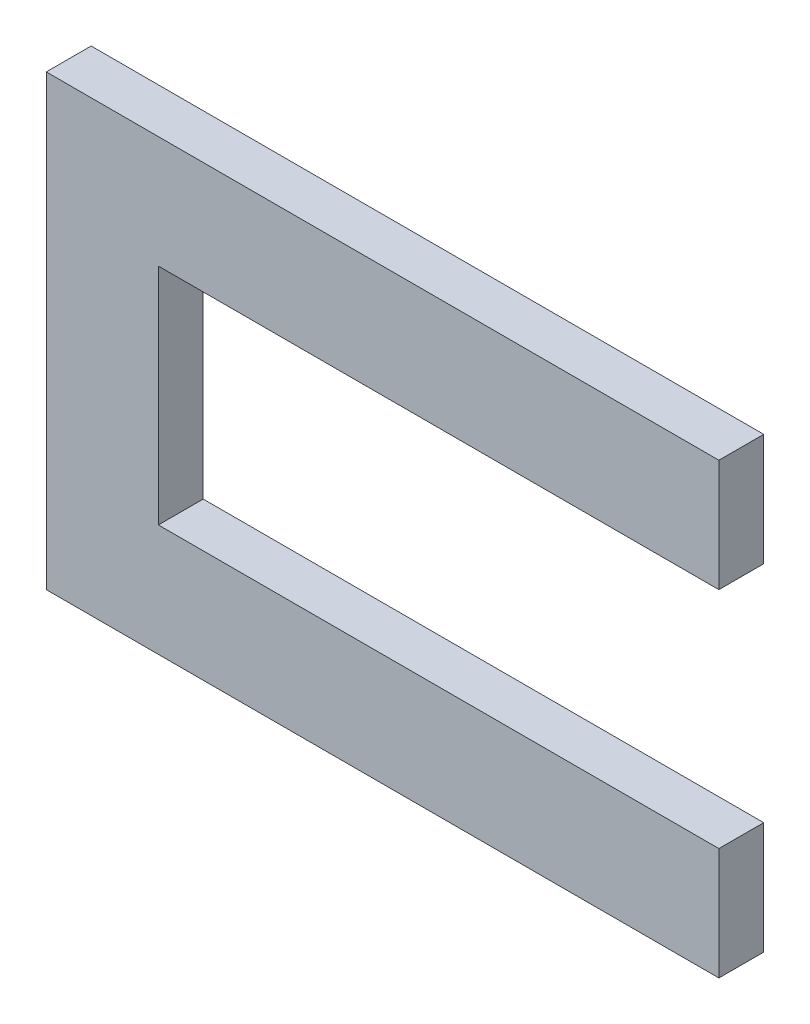
ISO-10303-21;
HEADER;
FILE_DESCRIPTION(('STEP AP214'),'2;1');
FILE_NAME('part.step','',(''),(''),'','','');
FILE_SCHEMA(('AUTOMOTIVE_DESIGN { 1 0 10303 214 1 1 1 1 }'));
ENDSEC;
DATA;
#1=APPLICATION_CONTEXT('core data for automotive mechanical design processes');
#2=APPLICATION_PROTOCOL_DEFINITION('international standard','automotive_design',2000,#1);
#3=PRODUCT_CONTEXT('',#1,'mechanical');
#4=PRODUCT('Part','Part','',(#3));
#5=PRODUCT_RELATED_PRODUCT_CATEGORY('part','',(#4));
#6=PRODUCT_DEFINITION_FORMATION('','',#4);
#7=PRODUCT_DEFINITION_CONTEXT('part definition',#1,'design');
#8=PRODUCT_DEFINITION('design','',#6,#7);
#9=PRODUCT_DEFINITION_SHAPE('','',#8);
#10=(LENGTH_UNIT() NAMED_UNIT(*) SI_UNIT(.MILLI.,.METRE.));
#11=(NAMED_UNIT(*) PLANE_ANGLE_UNIT() SI_UNIT($,.RADIAN.));
#12=(NAMED_UNIT(*) SI_UNIT($,.STERADIAN.) SOLID_ANGLE_UNIT());
#13=UNCERTAINTY_MEASURE_WITH_UNIT(LENGTH_MEASURE(1.E-05),#10,'distance_accuracy_value','');
#14=(GEOMETRIC_REPRESENTATION_CONTEXT(3) GLOBAL_UNCERTAINTY_ASSIGNED_CONTEXT((#13)) GLOBAL_UNIT_ASSIGNED_CONTEXT((#10,
#11,#12)) REPRESENTATION_CONTEXT('',''));
#15=CARTESIAN_POINT('',(0.,0.,0.));
#16=DIRECTION('',(0.,0.,1.));
#17=DIRECTION('',(1.,0.,0.));
#18=AXIS2_PLACEMENT_3D('',#15,#16,#17);
#19=CARTESIAN_POINT('',(0.,-5.,2.));
#20=DIRECTION('',(0.,-1.,0.));
#21=DIRECTION('',(1.,0.,0.));
#22=AXIS2_PLACEMENT_3D('',#19,#20,#21);
#23=PLANE('',#22);
#24=DIRECTION('',(-1.,0.,0.));
#25=VECTOR('',#24,1.);
#26=CARTESIAN_POINT('',(0.,-5.,0.));
#27=LINE('',#26,#25);
#28=CARTESIAN_POINT('',(15.,-5.,0.));
#29=VERTEX_POINT('',#28);
#30=CARTESIAN_POINT('',(-10.,-5.00000000000001,0.));
#31=VERTEX_POINT('',#30);
#32=EDGE_CURVE('E130',#29,#31,#27,.T.);
#33=ORIENTED_EDGE('',*,*,#32,.T.);
#34=DIRECTION('',(0.,0.,-1.));
#35=VECTOR('',#34,1.);
#36=CARTESIAN_POINT('',(-10.,-5.00000000000001,2.));
#37=LINE('',#36,#35);
#38=CARTESIAN_POINT('',(-10.,-5.00000000000001,2.));
#39=VERTEX_POINT('',#38);
#40=EDGE_CURVE('E11',#39,#31,#37,.T.);
#41=ORIENTED_EDGE('',*,*,#40,.F.);
#42=DIRECTION('',(-1.,0.,0.));
#43=VECTOR('',#42,1.);
#44=CARTESIAN_POINT('',(0.,-5.,2.));
#45=LINE('',#44,#43);
#46=CARTESIAN_POINT('',(15.,-5.,2.));
#47=VERTEX_POINT('',#46);
#48=EDGE_CURVE('E149',#47,#39,#45,.T.);
#49=ORIENTED_EDGE('',*,*,#48,.F.);
#50=DIRECTION('',(0.,0.,-1.));
#51=VECTOR('',#50,1.);
#52=CARTESIAN_POINT('',(15.,-5.,2.));
#53=LINE('',#52,#51);
#54=EDGE_CURVE('E49',#47,#29,#53,.T.);
#55=ORIENTED_EDGE('',*,*,#54,.T.);
#56=EDGE_LOOP('',(#33,#41,#49,#55));
#57=FACE_BOUND('',#56,.T.);
#58=ADVANCED_FACE('F33',(#57),#23,.F.);
#59=CARTESIAN_POINT('',(-10.,0.,2.));
#60=DIRECTION('',(-1.,0.,0.));
#61=DIRECTION('',(0.,-1.,0.));
#62=AXIS2_PLACEMENT_3D('',#59,#60,#61);
#63=PLANE('',#62);
#64=DIRECTION('',(0.,1.,0.));
#65=VECTOR('',#64,1.);
#66=CARTESIAN_POINT('',(-10.,0.,0.));
#67=LINE('',#66,#65);
#68=CARTESIAN_POINT('',(-10.,4.99999999999999,0.));
#69=VERTEX_POINT('',#68);
#70=EDGE_CURVE('E132',#31,#69,#67,.T.);
#71=ORIENTED_EDGE('',*,*,#70,.T.);
#72=DIRECTION('',(0.,0.,-1.));
#73=VECTOR('',#72,1.);
#74=CARTESIAN_POINT('',(-10.,4.99999999999999,2.));
#75=LINE('',#74,#73);
#76=CARTESIAN_POINT('',(-10.,4.99999999999999,2.));
#77=VERTEX_POINT('',#76);
#78=EDGE_CURVE('E41',#77,#69,#75,.T.);
#79=ORIENTED_EDGE('',*,*,#78,.F.);
#80=DIRECTION('',(0.,1.,0.));
#81=VECTOR('',#80,1.);
#82=CARTESIAN_POINT('',(-10.,0.,2.));
#83=LINE('',#82,#81);
#84=EDGE_CURVE('E88',#39,#77,#83,.T.);
#85=ORIENTED_EDGE('',*,*,#84,.F.);
#86=ORIENTED_EDGE('',*,*,#40,.T.);
#87=EDGE_LOOP('',(#71,#79,#85,#86));
#88=FACE_BOUND('',#87,.T.);
#89=ADVANCED_FACE('F176',(#88),#63,.F.);
#90=CARTESIAN_POINT('',(0.,4.99999999999999,2.));
#91=DIRECTION('',(0.,1.,0.));
#92=DIRECTION('',(-1.,0.,0.));
#93=AXIS2_PLACEMENT_3D('',#90,#91,#92);
#94=PLANE('',#93);
#95=DIRECTION('',(1.,0.,0.));
#96=VECTOR('',#95,1.);
#97=CARTESIAN_POINT('',(0.,4.99999999999999,0.));
#98=LINE('',#97,#96);
#99=CARTESIAN_POINT('',(15.,4.99999999999999,0.));
#100=VERTEX_POINT('',#99);
#101=EDGE_CURVE('E134',#69,#100,#98,.T.);
#102=ORIENTED_EDGE('',*,*,#101,.T.);
#103=DIRECTION('',(0.,0.,-1.));
#104=VECTOR('',#103,1.);
#105=CARTESIAN_POINT('',(15.,4.99999999999999,2.));
#106=LINE('',#105,#104);
#107=CARTESIAN_POINT('',(15.,4.99999999999999,2.));
#108=VERTEX_POINT('',#107);
#109=EDGE_CURVE('E155',#108,#100,#106,.T.);
#110=ORIENTED_EDGE('',*,*,#109,.F.);
#111=DIRECTION('',(1.,0.,0.));
#112=VECTOR('',#111,1.);
#113=CARTESIAN_POINT('',(0.,4.99999999999999,2.));
#114=LINE('',#113,#112);
#115=EDGE_CURVE('E162',#77,#108,#114,.T.);
#116=ORIENTED_EDGE('',*,*,#115,.F.);
#117=ORIENTED_EDGE('',*,*,#78,.T.);
#118=EDGE_LOOP('',(#102,#110,#116,#117));
#119=FACE_BOUND('',#118,.T.);
#120=ADVANCED_FACE('F160',(#119),#94,.F.);
#121=CARTESIAN_POINT('',(15.,0.,2.));
#122=DIRECTION('',(1.,0.,0.));
#123=DIRECTION('',(0.,1.,0.));
#124=AXIS2_PLACEMENT_3D('',#121,#122,#123);
#125=PLANE('',#124);
#126=DIRECTION('',(0.,-1.,0.));
#127=VECTOR('',#126,1.);
#128=CARTESIAN_POINT('',(15.,0.,0.));
#129=LINE('',#128,#127);
#130=CARTESIAN_POINT('',(15.,9.99999999999999,0.));
#131=VERTEX_POINT('',#130);
#132=EDGE_CURVE('E137',#131,#100,#129,.T.);
#133=ORIENTED_EDGE('',*,*,#132,.F.);
#134=DIRECTION('',(0.,0.,-1.));
#135=VECTOR('',#134,1.);
#136=CARTESIAN_POINT('',(15.,9.99999999999999,2.));
#137=LINE('',#136,#135);
#138=CARTESIAN_POINT('',(15.,9.99999999999999,2.));
#139=VERTEX_POINT('',#138);
#140=EDGE_CURVE('E153',#139,#131,#137,.T.);
#141=ORIENTED_EDGE('',*,*,#140,.F.);
#142=DIRECTION('',(0.,-1.,0.));
#143=VECTOR('',#142,1.);
#144=CARTESIAN_POINT('',(15.,0.,2.));
#145=LINE('',#144,#143);
#146=EDGE_CURVE('E170',#139,#108,#145,.T.);
#147=ORIENTED_EDGE('',*,*,#146,.T.);
#148=ORIENTED_EDGE('',*,*,#109,.T.);
#149=EDGE_LOOP('',(#133,#141,#147,#148));
#150=FACE_BOUND('',#149,.T.);
#151=ADVANCED_FACE('F168',(#150),#125,.T.);
#152=CARTESIAN_POINT('',(0.,9.99999999999999,2.));
#153=DIRECTION('',(0.,1.,0.));
#154=DIRECTION('',(-1.,0.,0.));
#155=AXIS2_PLACEMENT_3D('',#152,#153,#154);
#156=PLANE('',#155);
#157=DIRECTION('',(1.,0.,0.));
#158=VECTOR('',#157,1.);
#159=CARTESIAN_POINT('',(0.,9.99999999999999,0.));
#160=LINE('',#159,#158);
#161=CARTESIAN_POINT('',(-15.,9.99999999999999,0.));
#162=VERTEX_POINT('',#161);
#163=EDGE_CURVE('E140',#162,#131,#160,.T.);
#164=ORIENTED_EDGE('',*,*,#163,.F.);
#165=DIRECTION('',(0.,0.,-1.));
#166=VECTOR('',#165,1.);
#167=CARTESIAN_POINT('',(-15.,9.99999999999999,2.));
#168=LINE('',#167,#166);
#169=CARTESIAN_POINT('',(-15.,9.99999999999999,2.));
#170=VERTEX_POINT('',#169);
#171=EDGE_CURVE('E122',#170,#162,#168,.T.);
#172=ORIENTED_EDGE('',*,*,#171,.F.);
#173=DIRECTION('',(1.,0.,0.));
#174=VECTOR('',#173,1.);
#175=CARTESIAN_POINT('',(0.,9.99999999999999,2.));
#176=LINE('',#175,#174);
#177=EDGE_CURVE('E112',#170,#139,#176,.T.);
#178=ORIENTED_EDGE('',*,*,#177,.T.);
#179=ORIENTED_EDGE('',*,*,#140,.T.);
#180=EDGE_LOOP('',(#164,#172,#178,#179));
#181=FACE_BOUND('',#180,.T.);
#182=ADVANCED_FACE('F186',(#181),#156,.T.);
#183=CARTESIAN_POINT('',(-15.,0.,2.));
#184=DIRECTION('',(1.,0.,0.));
#185=DIRECTION('',(0.,1.,0.));
#186=AXIS2_PLACEMENT_3D('',#183,#184,#185);
#187=PLANE('',#186);
#188=DIRECTION('',(0.,-1.,0.));
#189=VECTOR('',#188,1.);
#190=CARTESIAN_POINT('',(-15.,0.,0.));
#191=LINE('',#190,#189);
#192=CARTESIAN_POINT('',(-15.,-10.,0.));
#193=VERTEX_POINT('',#192);
#194=EDGE_CURVE('E119',#162,#193,#191,.T.);
#195=ORIENTED_EDGE('',*,*,#194,.T.);
#196=DIRECTION('',(0.,0.,-1.));
#197=VECTOR('',#196,1.);
#198=CARTESIAN_POINT('',(-15.,-10.,2.));
#199=LINE('',#198,#197);
#200=CARTESIAN_POINT('',(-15.,-10.,2.));
#201=VERTEX_POINT('',#200);
#202=EDGE_CURVE('E116',#201,#193,#199,.T.);
#203=ORIENTED_EDGE('',*,*,#202,.F.);
#204=DIRECTION('',(0.,-1.,0.));
#205=VECTOR('',#204,1.);
#206=CARTESIAN_POINT('',(-15.,0.,2.));
#207=LINE('',#206,#205);
#208=EDGE_CURVE('E104',#170,#201,#207,.T.);
#209=ORIENTED_EDGE('',*,*,#208,.F.);
#210=ORIENTED_EDGE('',*,*,#171,.T.);
#211=EDGE_LOOP('',(#195,#203,#209,#210));
#212=FACE_BOUND('',#211,.T.);
#213=ADVANCED_FACE('F117',(#212),#187,.F.);
#214=CARTESIAN_POINT('',(0.,-10.,2.));
#215=DIRECTION('',(0.,1.,0.));
#216=DIRECTION('',(0.,0.,1.));
#217=AXIS2_PLACEMENT_3D('',#214,#215,#216);
#218=PLANE('',#217);
#219=DIRECTION('',(1.,0.,0.));
#220=VECTOR('',#219,1.);
#221=CARTESIAN_POINT('',(0.,-10.,0.));
#222=LINE('',#221,#220);
#223=CARTESIAN_POINT('',(15.,-10.,0.));
#224=VERTEX_POINT('',#223);
#225=EDGE_CURVE('E144',#193,#224,#222,.T.);
#226=ORIENTED_EDGE('',*,*,#225,.T.);
#227=DIRECTION('',(0.,0.,-1.));
#228=VECTOR('',#227,1.);
#229=CARTESIAN_POINT('',(15.,-10.,2.));
#230=LINE('',#229,#228);
#231=CARTESIAN_POINT('',(15.,-10.,2.));
#232=VERTEX_POINT('',#231);
#233=EDGE_CURVE('E76',#232,#224,#230,.T.);
#234=ORIENTED_EDGE('',*,*,#233,.F.);
#235=DIRECTION('',(1.,0.,0.));
#236=VECTOR('',#235,1.);
#237=CARTESIAN_POINT('',(0.,-10.,2.));
#238=LINE('',#237,#236);
#239=EDGE_CURVE('E109',#201,#232,#238,.T.);
#240=ORIENTED_EDGE('',*,*,#239,.F.);
#241=ORIENTED_EDGE('',*,*,#202,.T.);
#242=EDGE_LOOP('',(#226,#234,#240,#241));
#243=FACE_BOUND('',#242,.T.);
#244=ADVANCED_FACE('F124',(#243),#218,.F.);
#245=CARTESIAN_POINT('',(15.,0.,2.));
#246=DIRECTION('',(1.,0.,0.));
#247=DIRECTION('',(0.,1.,0.));
#248=AXIS2_PLACEMENT_3D('',#245,#246,#247);
#249=PLANE('',#248);
#250=DIRECTION('',(0.,-1.,0.));
#251=VECTOR('',#250,1.);
#252=CARTESIAN_POINT('',(15.,0.,0.));
#253=LINE('',#252,#251);
#254=EDGE_CURVE('E146',#29,#224,#253,.T.);
#255=ORIENTED_EDGE('',*,*,#254,.F.);
#256=ORIENTED_EDGE('',*,*,#54,.F.);
#257=DIRECTION('',(0.,-1.,0.));
#258=VECTOR('',#257,1.);
#259=CARTESIAN_POINT('',(15.,0.,2.));
#260=LINE('',#259,#258);
#261=EDGE_CURVE('E125',#47,#232,#260,.T.);
#262=ORIENTED_EDGE('',*,*,#261,.T.);
#263=ORIENTED_EDGE('',*,*,#233,.T.);
#264=EDGE_LOOP('',(#255,#256,#262,#263));
#265=FACE_BOUND('',#264,.T.);
#266=ADVANCED_FACE('F194',(#265),#249,.T.);
#267=CARTESIAN_POINT('',(0.,0.,2.));
#268=DIRECTION('',(0.,0.,1.));
#269=DIRECTION('',(1.,0.,0.));
#270=AXIS2_PLACEMENT_3D('',#267,#268,#269);
#271=PLANE('',#270);
#272=ORIENTED_EDGE('',*,*,#48,.T.);
#273=ORIENTED_EDGE('',*,*,#84,.T.);
#274=ORIENTED_EDGE('',*,*,#115,.T.);
#275=ORIENTED_EDGE('',*,*,#146,.F.);
#276=ORIENTED_EDGE('',*,*,#177,.F.);
#277=ORIENTED_EDGE('',*,*,#208,.T.);
#278=ORIENTED_EDGE('',*,*,#239,.T.);
#279=ORIENTED_EDGE('',*,*,#261,.F.);
#280=EDGE_LOOP('',(#272,#273,#274,#275,#276,#277,#278,#279));
#281=FACE_BOUND('',#280,.T.);
#282=ADVANCED_FACE('F106',(#281),#271,.T.);
#283=CARTESIAN_POINT('',(0.,0.,0.));
#284=DIRECTION('',(0.,0.,1.));
#285=DIRECTION('',(1.,0.,0.));
#286=AXIS2_PLACEMENT_3D('',#283,#284,#285);
#287=PLANE('',#286);
#288=ORIENTED_EDGE('',*,*,#32,.F.);
#289=ORIENTED_EDGE('',*,*,#254,.T.);
#290=ORIENTED_EDGE('',*,*,#225,.F.);
#291=ORIENTED_EDGE('',*,*,#194,.F.);
#292=ORIENTED_EDGE('',*,*,#163,.T.);
#293=ORIENTED_EDGE('',*,*,#132,.T.);
#294=ORIENTED_EDGE('',*,*,#101,.F.);
#295=ORIENTED_EDGE('',*,*,#70,.F.);
#296=EDGE_LOOP('',(#288,#289,#290,#291,#292,#293,#294,#295));
#297=FACE_BOUND('',#296,.T.);
#298=ADVANCED_FACE('F164',(#297),#287,.F.);
#299=CLOSED_SHELL('',(#58,#89,#120,#151,#182,#213,#244,#266,#282,#298));
#300=MANIFOLD_SOLID_BREP('B2',#299);
#301=ADVANCED_BREP_SHAPE_REPRESENTATION('',(#18,#300),#14);
#302=SHAPE_DEFINITION_REPRESENTATION(#9,#301);
ENDSEC;
END-ISO-10303-21;
